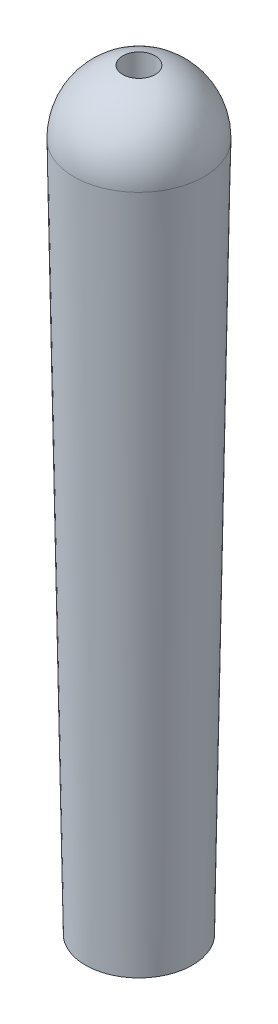
ISO-10303-21;
HEADER;
FILE_DESCRIPTION(('STEP AP214'),'2;1');
FILE_NAME('part.step','',(''),(''),'','','');
FILE_SCHEMA(('AUTOMOTIVE_DESIGN { 1 0 10303 214 1 1 1 1 }'));
ENDSEC;
DATA;
#1=APPLICATION_CONTEXT('core data for automotive mechanical design processes');
#2=APPLICATION_PROTOCOL_DEFINITION('international standard','automotive_design',2000,#1);
#3=PRODUCT_CONTEXT('',#1,'mechanical');
#4=PRODUCT('Part','Part','',(#3));
#5=PRODUCT_RELATED_PRODUCT_CATEGORY('part','',(#4));
#6=PRODUCT_DEFINITION_FORMATION('','',#4);
#7=PRODUCT_DEFINITION_CONTEXT('part definition',#1,'design');
#8=PRODUCT_DEFINITION('design','',#6,#7);
#9=PRODUCT_DEFINITION_SHAPE('','',#8);
#10=(LENGTH_UNIT() NAMED_UNIT(*) SI_UNIT(.MILLI.,.METRE.));
#11=(NAMED_UNIT(*) PLANE_ANGLE_UNIT() SI_UNIT($,.RADIAN.));
#12=(NAMED_UNIT(*) SI_UNIT($,.STERADIAN.) SOLID_ANGLE_UNIT());
#13=UNCERTAINTY_MEASURE_WITH_UNIT(LENGTH_MEASURE(1.E-05),#10,'distance_accuracy_value','');
#14=(GEOMETRIC_REPRESENTATION_CONTEXT(3) GLOBAL_UNCERTAINTY_ASSIGNED_CONTEXT((#13)) GLOBAL_UNIT_ASSIGNED_CONTEXT((#10,
#11,#12)) REPRESENTATION_CONTEXT('',''));
#15=CARTESIAN_POINT('',(0.,0.,0.));
#16=DIRECTION('',(0.,0.,1.));
#17=DIRECTION('',(1.,0.,0.));
#18=AXIS2_PLACEMENT_3D('',#15,#16,#17);
#19=CARTESIAN_POINT('',(51.0095635445637,49.0462948383227,0.));
#20=DIRECTION('',(0.,1.,0.));
#21=DIRECTION('',(0.,0.,1.));
#22=AXIS2_PLACEMENT_3D('',#19,#20,#21);
#23=PLANE('',#22);
#24=CARTESIAN_POINT('',(66.7177247622718,49.0462948383227,0.));
#25=DIRECTION('',(0.,-1.,0.));
#26=DIRECTION('',(0.,0.,-1.));
#27=AXIS2_PLACEMENT_3D('',#24,#25,#26);
#28=CIRCLE('',#27,4.7625);
#29=CARTESIAN_POINT('',(66.7177247622718,49.0462948383227,-4.7625));
#30=VERTEX_POINT('',#29);
#31=EDGE_CURVE('E44',#30,#30,#28,.T.);
#32=ORIENTED_EDGE('',*,*,#31,.F.);
#33=EDGE_LOOP('',(#32));
#34=FACE_BOUND('',#33,.T.);
#35=CARTESIAN_POINT('',(66.7177247622718,49.0462948383227,0.));
#36=DIRECTION('',(0.,-1.,0.));
#37=DIRECTION('',(0.,0.,-1.));
#38=AXIS2_PLACEMENT_3D('',#35,#36,#37);
#39=CIRCLE('',#38,15.7081612177081);
#40=CARTESIAN_POINT('',(66.7177247622718,49.0462948383227,-15.7081612177081));
#41=VERTEX_POINT('',#40);
#42=EDGE_CURVE('E10',#41,#41,#39,.T.);
#43=ORIENTED_EDGE('',*,*,#42,.T.);
#44=EDGE_LOOP('',(#43));
#45=FACE_BOUND('',#44,.T.);
#46=ADVANCED_FACE('F31',(#34,#45),#23,.F.);
#47=CARTESIAN_POINT('',(66.7177247622718,251.129666179649,0.));
#48=DIRECTION('',(0.,1.,0.));
#49=DIRECTION('',(0.,0.,1.));
#50=AXIS2_PLACEMENT_3D('',#47,#48,#49);
#51=CONICAL_SURFACE('',#50,19.1045203999153,0.0168051405150419);
#52=ORIENTED_EDGE('',*,*,#42,.F.);
#53=EDGE_LOOP('',(#52));
#54=FACE_BOUND('',#53,.T.);
#55=CARTESIAN_POINT('',(66.7177247622718,251.129666179649,0.));
#56=DIRECTION('',(0.,-1.,0.));
#57=DIRECTION('',(0.,0.,-1.));
#58=AXIS2_PLACEMENT_3D('',#55,#56,#57);
#59=CIRCLE('',#58,19.1045203999153);
#60=CARTESIAN_POINT('',(47.6132043623565,251.129666179649,0.));
#61=VERTEX_POINT('',#60);
#62=EDGE_CURVE('E38',#61,#61,#59,.T.);
#63=ORIENTED_EDGE('',*,*,#62,.T.);
#64=EDGE_LOOP('',(#63));
#65=FACE_BOUND('',#64,.T.);
#66=ADVANCED_FACE('F60',(#54,#65),#51,.T.);
#67=CARTESIAN_POINT('',(66.7177247622718,251.450750556118,0.));
#68=DIRECTION('',(0.,-1.,0.));
#69=DIRECTION('',(-1.,0.,0.));
#70=AXIS2_PLACEMENT_3D('',#67,#68,#69);
#71=SPHERICAL_SURFACE('',#70,19.1072183974432);
#72=CARTESIAN_POINT('',(66.7177247622718,269.954922751534,0.));
#73=DIRECTION('',(0.,-1.,0.));
#74=DIRECTION('',(0.,0.,-1.));
#75=AXIS2_PLACEMENT_3D('',#72,#73,#74);
#76=CIRCLE('',#75,4.7625);
#77=CARTESIAN_POINT('',(61.9552247622718,269.954922751534,0.));
#78=VERTEX_POINT('',#77);
#79=EDGE_CURVE('E34',#78,#78,#76,.T.);
#80=CARTESIAN_POINT('',(61.9552247622718,269.954922751534,0.));
#81=CARTESIAN_POINT('',(61.6977662826389,269.888663114279,0.));
#82=CARTESIAN_POINT('',(61.4416926670016,269.817023746248,0.));
#83=CARTESIAN_POINT('',(60.932756834962,269.663124935997,0.));
#84=CARTESIAN_POINT('',(60.6798946185597,269.580865493778,0.));
#85=CARTESIAN_POINT('',(60.1778232562339,269.405865922521,0.));
#86=CARTESIAN_POINT('',(59.9286141103103,269.313125793483,0.));
#87=CARTESIAN_POINT('',(59.4342826975059,269.117327450576,0.));
#88=CARTESIAN_POINT('',(59.1891604306249,269.014269236708,0.));
#89=CARTESIAN_POINT('',(58.7034298667294,268.798013972098,0.));
#90=CARTESIAN_POINT('',(58.4628215697147,268.684816921357,0.));
#91=CARTESIAN_POINT('',(57.986538065363,268.44848124884,0.));
#92=CARTESIAN_POINT('',(57.7508628580259,268.325342627064,0.));
#93=CARTESIAN_POINT('',(57.2848560881762,268.06933830129,0.));
#94=CARTESIAN_POINT('',(57.0545245256636,267.936472597292,0.));
#95=CARTESIAN_POINT('',(56.5996062841892,267.66124556613,0.));
#96=CARTESIAN_POINT('',(56.3750196052273,267.518884238966,0.));
#97=CARTESIAN_POINT('',(55.9319823639948,267.224913955177,0.));
#98=CARTESIAN_POINT('',(55.713531801724,267.07330499855,0.));
#99=CARTESIAN_POINT('',(55.2831473372698,266.761103560852,0.));
#100=CARTESIAN_POINT('',(55.0712134350864,266.600511079781,0.));
#101=CARTESIAN_POINT('',(54.6542314822513,266.270622347128,0.));
#102=CARTESIAN_POINT('',(54.4491834315996,266.101326095546,0.));
#103=CARTESIAN_POINT('',(54.0463303779963,265.754324738011,0.));
#104=CARTESIAN_POINT('',(53.8485253750447,265.576619632058,0.));
#105=CARTESIAN_POINT('',(53.4605029955438,265.213110130211,0.));
#106=CARTESIAN_POINT('',(53.2702856189947,265.027305734318,0.));
#107=CARTESIAN_POINT('',(52.8977698532617,264.647921326088,0.));
#108=CARTESIAN_POINT('',(52.715471464078,264.454341313753,0.));
#109=CARTESIAN_POINT('',(52.3591112390681,264.059742891357,0.));
#110=CARTESIAN_POINT('',(52.185049403242,263.858724481295,0.));
#111=CARTESIAN_POINT('',(51.8454655027641,263.449599439941,0.));
#112=CARTESIAN_POINT('',(51.6799434381124,263.241492808648,0.));
#113=CARTESIAN_POINT('',(51.3577274214158,262.818553849091,0.));
#114=CARTESIAN_POINT('',(51.2010334693709,262.603721520827,0.));
#115=CARTESIAN_POINT('',(50.8967466406419,262.167705407835,0.));
#116=CARTESIAN_POINT('',(50.7491537639576,261.946521623106,0.));
#117=CARTESIAN_POINT('',(50.4633261945208,261.498187902005,0.));
#118=CARTESIAN_POINT('',(50.3250915017682,261.271037965632,0.));
#119=CARTESIAN_POINT('',(50.0582211066956,260.811167639169,0.));
#120=CARTESIAN_POINT('',(49.9295854043756,260.57844724908,0.));
#121=CARTESIAN_POINT('',(49.6821370751149,260.10784141691,0.));
#122=CARTESIAN_POINT('',(49.5633244481741,259.869955974829,0.));
#123=CARTESIAN_POINT('',(49.3357292426928,259.389434437986,0.));
#124=CARTESIAN_POINT('',(49.2269466641522,259.146798343223,0.));
#125=CARTESIAN_POINT('',(49.0196010560637,258.657198176017,0.));
#126=CARTESIAN_POINT('',(48.9210380265158,258.410234103574,0.));
#127=CARTESIAN_POINT('',(48.7343032142902,257.912408195402,0.));
#128=CARTESIAN_POINT('',(48.6461314316124,257.661546359673,0.));
#129=CARTESIAN_POINT('',(48.4803327098405,257.156361929262,0.));
#130=CARTESIAN_POINT('',(48.4027057707464,256.902039334581,0.));
#131=CARTESIAN_POINT('',(48.2581319616946,256.390376419328,0.));
#132=CARTESIAN_POINT('',(48.1911850917369,256.133036098758,0.));
#133=CARTESIAN_POINT('',(48.0680880488522,255.615786021528,0.));
#134=CARTESIAN_POINT('',(48.0119378759252,255.355876264869,0.));
#135=CARTESIAN_POINT('',(47.9105320203327,254.833940081919,0.));
#136=CARTESIAN_POINT('',(47.8652763376672,254.571913655627,0.));
#137=CARTESIAN_POINT('',(47.7857383770933,254.046200584645,0.));
#138=CARTESIAN_POINT('',(47.751456099185,253.782513939954,0.));
#139=CARTESIAN_POINT('',(47.6939243751109,253.253939784802,0.));
#140=CARTESIAN_POINT('',(47.6706749289452,252.989052274339,0.));
#141=CARTESIAN_POINT('',(47.6352504632455,252.458537797593,0.));
#142=CARTESIAN_POINT('',(47.6230754437115,252.192910831308,0.));
#143=CARTESIAN_POINT('',(47.6098169571677,251.661380270132,0.));
#144=CARTESIAN_POINT('',(47.608733490158,251.395476675239,0.));
#145=CARTESIAN_POINT('',(47.6132043623565,251.129666179649,0.));
#146=B_SPLINE_CURVE_WITH_KNOTS('',3,(#80,#81,#82,#83,#84,#85,#86,#87,#88,#89,#90,#91,#92,#93,
#94,#95,#96,#97,#98,#99,#100,#101,#102,#103,#104,#105,#106,#107,#108,#109,#110,#111,#112,#113,
#114,#115,#116,#117,#118,#119,#120,#121,#122,#123,#124,#125,#126,#127,#128,#129,#130,#131,#132,
#133,#134,#135,#136,#137,#138,#139,#140,#141,#142,#143,#144,#145),.UNSPECIFIED.,.F.,.F.,(4,2,2,
2,2,2,2,2,2,2,2,2,2,2,2,2,2,2,2,2,2,2,2,2,2,2,2,2,2,2,2,2,4),(0.,0.79748596025117,
1.59497192050236,2.39245788075352,3.1899438410047,3.98742980125587,4.78491576150705,
5.5824017217582,6.37988768200939,7.17737364226057,7.97485960251174,8.77234556276291,
9.56983152301406,10.3673174832652,11.1648034435164,11.9622894037676,12.7597753640188,
13.5572613242699,14.3547472845211,15.1522332447723,15.9497192050234,16.7472051652746,
17.5446911255258,18.342177085777,19.1396630460281,19.9371490062793,20.7346349665305,
21.5321209267817,22.3296068870328,23.127092847284,23.9245788075352,24.7220647677864,
25.5195507280376),.UNSPECIFIED.);
#147=EDGE_CURVE('BSEAM51',#78,#61,#146,.T.);
#148=ORIENTED_EDGE('',*,*,#79,.T.);
#149=ORIENTED_EDGE('',*,*,#62,.F.);
#150=ORIENTED_EDGE('',*,*,#147,.T.);
#151=ORIENTED_EDGE('',*,*,#147,.F.);
#152=EDGE_LOOP('',(#148,#150,#149,#151));
#153=FACE_BOUND('',#152,.T.);
#154=ADVANCED_FACE('F51',(#153),#71,.T.);
#155=CARTESIAN_POINT('',(66.7177247622718,270.557968953561,0.));
#156=DIRECTION('',(0.,-1.,0.));
#157=DIRECTION('',(0.,0.,-1.));
#158=AXIS2_PLACEMENT_3D('',#155,#156,#157);
#159=CYLINDRICAL_SURFACE('',#158,4.7625);
#160=ORIENTED_EDGE('',*,*,#31,.T.);
#161=EDGE_LOOP('',(#160));
#162=FACE_BOUND('',#161,.T.);
#163=ORIENTED_EDGE('',*,*,#79,.F.);
#164=EDGE_LOOP('',(#163));
#165=FACE_BOUND('',#164,.T.);
#166=ADVANCED_FACE('F54',(#162,#165),#159,.F.);
#167=CLOSED_SHELL('',(#46,#66,#154,#166));
#168=MANIFOLD_SOLID_BREP('B2',#167);
#169=ADVANCED_BREP_SHAPE_REPRESENTATION('',(#18,#168),#14);
#170=SHAPE_DEFINITION_REPRESENTATION(#9,#169);
ENDSEC;
END-ISO-10303-21;
